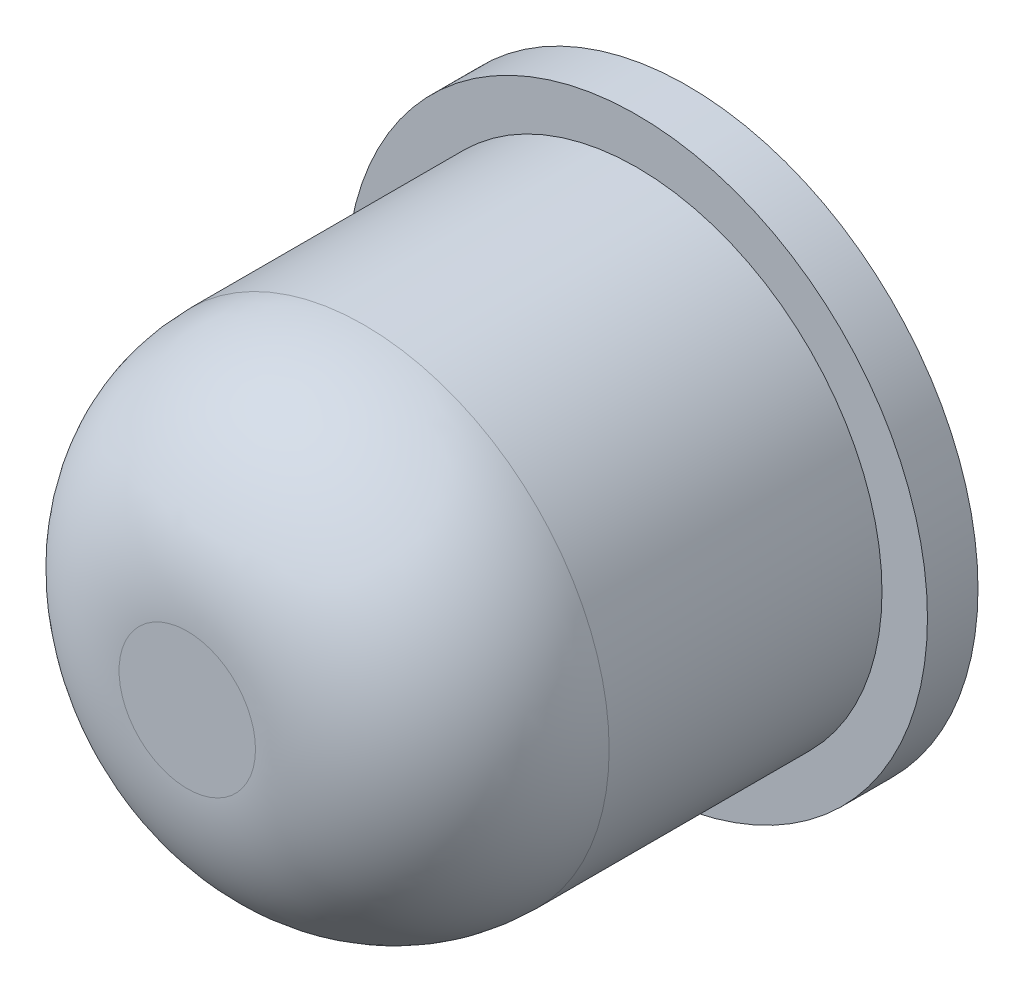
ISO-10303-21;
HEADER;
FILE_DESCRIPTION(('STEP AP214'),'2;1');
FILE_NAME('part.step','',(''),(''),'','','');
FILE_SCHEMA(('AUTOMOTIVE_DESIGN { 1 0 10303 214 1 1 1 1 }'));
ENDSEC;
DATA;
#1=APPLICATION_CONTEXT('core data for automotive mechanical design processes');
#2=APPLICATION_PROTOCOL_DEFINITION('international standard','automotive_design',2000,#1);
#3=PRODUCT_CONTEXT('',#1,'mechanical');
#4=PRODUCT('Part','Part','',(#3));
#5=PRODUCT_RELATED_PRODUCT_CATEGORY('part','',(#4));
#6=PRODUCT_DEFINITION_FORMATION('','',#4);
#7=PRODUCT_DEFINITION_CONTEXT('part definition',#1,'design');
#8=PRODUCT_DEFINITION('design','',#6,#7);
#9=PRODUCT_DEFINITION_SHAPE('','',#8);
#10=(LENGTH_UNIT() NAMED_UNIT(*) SI_UNIT(.MILLI.,.METRE.));
#11=(NAMED_UNIT(*) PLANE_ANGLE_UNIT() SI_UNIT($,.RADIAN.));
#12=(NAMED_UNIT(*) SI_UNIT($,.STERADIAN.) SOLID_ANGLE_UNIT());
#13=UNCERTAINTY_MEASURE_WITH_UNIT(LENGTH_MEASURE(1.E-05),#10,'distance_accuracy_value','');
#14=(GEOMETRIC_REPRESENTATION_CONTEXT(3) GLOBAL_UNCERTAINTY_ASSIGNED_CONTEXT((#13)) GLOBAL_UNIT_ASSIGNED_CONTEXT((#10,
#11,#12)) REPRESENTATION_CONTEXT('',''));
#15=CARTESIAN_POINT('',(0.,0.,0.));
#16=DIRECTION('',(0.,0.,1.));
#17=DIRECTION('',(1.,0.,0.));
#18=AXIS2_PLACEMENT_3D('',#15,#16,#17);
#19=CARTESIAN_POINT('',(0.,0.,10.5));
#20=DIRECTION('',(0.,0.,1.));
#21=DIRECTION('',(1.,0.,0.));
#22=AXIS2_PLACEMENT_3D('',#19,#20,#21);
#23=PLANE('',#22);
#24=CARTESIAN_POINT('',(0.,0.,10.5));
#25=DIRECTION('',(0.,0.,1.));
#26=DIRECTION('',(1.,0.,0.));
#27=AXIS2_PLACEMENT_3D('',#24,#25,#26);
#28=CIRCLE('',#27,1.35);
#29=CARTESIAN_POINT('',(1.35,0.,10.5));
#30=VERTEX_POINT('',#29);
#31=EDGE_CURVE('E9',#30,#30,#28,.T.);
#32=ORIENTED_EDGE('',*,*,#31,.T.);
#33=EDGE_LOOP('',(#32));
#34=FACE_BOUND('',#33,.T.);
#35=ADVANCED_FACE('F14',(#34),#23,.T.);
#36=CARTESIAN_POINT('',(4.85,0.,7.));
#37=CARTESIAN_POINT('',(4.85,0.,7.458148928649));
#38=CARTESIAN_POINT('',(4.778034416865,0.,7.916297092063));
#39=CARTESIAN_POINT('',(4.634101375765,0.,8.36031933005));
#40=CARTESIAN_POINT('',(4.421906269685,0.,8.776066494927));
#41=CARTESIAN_POINT('',(4.148833948394,0.,9.150913519912));
#42=CARTESIAN_POINT('',(3.500913519912,0.,9.798833948394));
#43=CARTESIAN_POINT('',(3.126066494927,0.,10.071906269685));
#44=CARTESIAN_POINT('',(2.71031933005,0.,10.284101375765));
#45=CARTESIAN_POINT('',(2.266297092063,0.,10.428034416865));
#46=CARTESIAN_POINT('',(1.808148928649,0.,10.5));
#47=CARTESIAN_POINT('',(1.35,0.,10.5));
#48=(BOUNDED_CURVE() B_SPLINE_CURVE(6,(#36,#37,#38,#39,#40,#41,#42,#43,#44,#45,#46,#47),
.UNSPECIFIED.,.F.,.F.) B_SPLINE_CURVE_WITH_KNOTS((7,5,7),(0.,0.785398163397,1.570796326795),
.UNSPECIFIED.) CURVE() GEOMETRIC_REPRESENTATION_ITEM() RATIONAL_B_SPLINE_CURVE((1.,1.,1.,1.,1.,
1.,1.,1.,1.,1.,1.,1.)) REPRESENTATION_ITEM(''));
#49=CARTESIAN_POINT('',(0.,0.,7.));
#50=DIRECTION('',(0.,0.,-1.));
#51=AXIS1_PLACEMENT('',#49,#50);
#52=SURFACE_OF_REVOLUTION('',#48,#51);
#53=ORIENTED_EDGE('',*,*,#31,.F.);
#54=EDGE_LOOP('',(#53));
#55=FACE_BOUND('',#54,.T.);
#56=CARTESIAN_POINT('',(0.,0.,7.));
#57=DIRECTION('',(0.,0.,1.));
#58=DIRECTION('',(1.,0.,0.));
#59=AXIS2_PLACEMENT_3D('',#56,#57,#58);
#60=CIRCLE('',#59,4.85);
#61=CARTESIAN_POINT('',(4.85,0.,7.));
#62=VERTEX_POINT('',#61);
#63=EDGE_CURVE('E47',#62,#62,#60,.T.);
#64=ORIENTED_EDGE('',*,*,#63,.T.);
#65=EDGE_LOOP('',(#64));
#66=FACE_BOUND('',#65,.T.);
#67=ADVANCED_FACE('F88',(#55,#66),#52,.F.);
#68=CARTESIAN_POINT('',(0.,0.,9.95));
#69=DIRECTION('',(0.,0.,1.));
#70=DIRECTION('',(1.,0.,0.));
#71=AXIS2_PLACEMENT_3D('',#68,#69,#70);
#72=PLANE('',#71);
#73=CARTESIAN_POINT('',(0.,0.,9.95));
#74=DIRECTION('',(0.,0.,1.));
#75=DIRECTION('',(1.,0.,0.));
#76=AXIS2_PLACEMENT_3D('',#73,#74,#75);
#77=CIRCLE('',#76,1.35);
#78=CARTESIAN_POINT('',(1.35,0.,9.95));
#79=VERTEX_POINT('',#78);
#80=EDGE_CURVE('E21',#79,#79,#77,.T.);
#81=ORIENTED_EDGE('',*,*,#80,.F.);
#82=EDGE_LOOP('',(#81));
#83=FACE_BOUND('',#82,.T.);
#84=ADVANCED_FACE('F85',(#83),#72,.F.);
#85=CARTESIAN_POINT('',(4.3,0.,7.));
#86=CARTESIAN_POINT('',(4.3,0.,7.386154097004));
#87=CARTESIAN_POINT('',(4.239343294215,0.,7.772307549024));
#88=CARTESIAN_POINT('',(4.118028302431,0.,8.146554863899));
#89=CARTESIAN_POINT('',(3.939178141592,0.,8.496970331438));
#90=CARTESIAN_POINT('',(3.709017185075,0.,8.812912823926));
#91=CARTESIAN_POINT('',(3.162912823926,0.,9.359017185075));
#92=CARTESIAN_POINT('',(2.846970331439,0.,9.589178141592));
#93=CARTESIAN_POINT('',(2.496554863899,0.,9.768028302431));
#94=CARTESIAN_POINT('',(2.122307549024,0.,9.889343294215));
#95=CARTESIAN_POINT('',(1.736154097004,0.,9.95));
#96=CARTESIAN_POINT('',(1.35,0.,9.95));
#97=(BOUNDED_CURVE() B_SPLINE_CURVE(6,(#85,#86,#87,#88,#89,#90,#91,#92,#93,#94,#95,#96),
.UNSPECIFIED.,.F.,.F.) B_SPLINE_CURVE_WITH_KNOTS((7,5,7),(0.,0.785398163397,1.570796326795),
.UNSPECIFIED.) CURVE() GEOMETRIC_REPRESENTATION_ITEM() RATIONAL_B_SPLINE_CURVE((1.,1.,1.,1.,1.,
1.,1.,1.,1.,1.,1.,1.)) REPRESENTATION_ITEM(''));
#98=CARTESIAN_POINT('',(0.,0.,7.));
#99=DIRECTION('',(0.,0.,-1.));
#100=AXIS1_PLACEMENT('',#98,#99);
#101=SURFACE_OF_REVOLUTION('',#97,#100);
#102=ORIENTED_EDGE('',*,*,#80,.T.);
#103=EDGE_LOOP('',(#102));
#104=FACE_BOUND('',#103,.T.);
#105=CARTESIAN_POINT('',(0.,0.,7.));
#106=DIRECTION('',(0.,0.,1.));
#107=DIRECTION('',(1.,0.,0.));
#108=AXIS2_PLACEMENT_3D('',#105,#106,#107);
#109=CIRCLE('',#108,4.3);
#110=CARTESIAN_POINT('',(4.3,0.,7.));
#111=VERTEX_POINT('',#110);
#112=EDGE_CURVE('E28',#111,#111,#109,.T.);
#113=ORIENTED_EDGE('',*,*,#112,.F.);
#114=EDGE_LOOP('',(#113));
#115=FACE_BOUND('',#114,.T.);
#116=ADVANCED_FACE('F71',(#104,#115),#101,.T.);
#117=CARTESIAN_POINT('',(0.,0.,0.6));
#118=DIRECTION('',(0.,0.,-1.));
#119=DIRECTION('',(1.,0.,0.));
#120=AXIS2_PLACEMENT_3D('',#117,#118,#119);
#121=CYLINDRICAL_SURFACE('',#120,4.3);
#122=ORIENTED_EDGE('',*,*,#112,.T.);
#123=EDGE_LOOP('',(#122));
#124=FACE_BOUND('',#123,.T.);
#125=CARTESIAN_POINT('',(0.,0.,0.6));
#126=DIRECTION('',(0.,0.,1.));
#127=DIRECTION('',(1.,0.,0.));
#128=AXIS2_PLACEMENT_3D('',#125,#126,#127);
#129=CIRCLE('',#128,4.3);
#130=CARTESIAN_POINT('',(4.30000000000003,0.,0.6));
#131=VERTEX_POINT('',#130);
#132=EDGE_CURVE('E36',#131,#131,#129,.T.);
#133=ORIENTED_EDGE('',*,*,#132,.F.);
#134=EDGE_LOOP('',(#133));
#135=FACE_BOUND('',#134,.T.);
#136=ADVANCED_FACE('F69',(#124,#135),#121,.F.);
#137=CARTESIAN_POINT('',(0.,0.,0.6));
#138=DIRECTION('',(0.,0.,1.));
#139=DIRECTION('',(1.,0.,0.));
#140=AXIS2_PLACEMENT_3D('',#137,#138,#139);
#141=PLANE('',#140);
#142=ORIENTED_EDGE('',*,*,#132,.T.);
#143=EDGE_LOOP('',(#142));
#144=FACE_BOUND('',#143,.T.);
#145=CARTESIAN_POINT('',(0.,0.,0.6));
#146=DIRECTION('',(0.,0.,1.));
#147=DIRECTION('',(1.,0.,0.));
#148=AXIS2_PLACEMENT_3D('',#145,#146,#147);
#149=CIRCLE('',#148,5.75);
#150=CARTESIAN_POINT('',(5.75,0.,0.6));
#151=VERTEX_POINT('',#150);
#152=EDGE_CURVE('E53',#151,#151,#149,.T.);
#153=ORIENTED_EDGE('',*,*,#152,.F.);
#154=EDGE_LOOP('',(#153));
#155=FACE_BOUND('',#154,.T.);
#156=ADVANCED_FACE('F70',(#144,#155),#141,.F.);
#157=CARTESIAN_POINT('',(0.,0.,0.6));
#158=DIRECTION('',(0.,0.,-1.));
#159=DIRECTION('',(1.,0.,0.));
#160=AXIS2_PLACEMENT_3D('',#157,#158,#159);
#161=CYLINDRICAL_SURFACE('',#160,5.75);
#162=CARTESIAN_POINT('',(0.,0.,1.6));
#163=DIRECTION('',(0.,0.,1.));
#164=DIRECTION('',(1.,0.,0.));
#165=AXIS2_PLACEMENT_3D('',#162,#163,#164);
#166=CIRCLE('',#165,5.75);
#167=CARTESIAN_POINT('',(5.75,0.,1.6));
#168=VERTEX_POINT('',#167);
#169=EDGE_CURVE('E49',#168,#168,#166,.T.);
#170=ORIENTED_EDGE('',*,*,#169,.F.);
#171=EDGE_LOOP('',(#170));
#172=FACE_BOUND('',#171,.T.);
#173=ORIENTED_EDGE('',*,*,#152,.T.);
#174=EDGE_LOOP('',(#173));
#175=FACE_BOUND('',#174,.T.);
#176=ADVANCED_FACE('F79',(#172,#175),#161,.T.);
#177=CARTESIAN_POINT('',(0.,0.,1.6));
#178=DIRECTION('',(0.,0.,1.));
#179=DIRECTION('',(1.,0.,0.));
#180=AXIS2_PLACEMENT_3D('',#177,#178,#179);
#181=PLANE('',#180);
#182=CARTESIAN_POINT('',(0.,0.,1.6));
#183=DIRECTION('',(0.,0.,1.));
#184=DIRECTION('',(1.,0.,0.));
#185=AXIS2_PLACEMENT_3D('',#182,#183,#184);
#186=CIRCLE('',#185,4.85);
#187=CARTESIAN_POINT('',(4.85,0.,1.6));
#188=VERTEX_POINT('',#187);
#189=EDGE_CURVE('E44',#188,#188,#186,.T.);
#190=ORIENTED_EDGE('',*,*,#189,.F.);
#191=EDGE_LOOP('',(#190));
#192=FACE_BOUND('',#191,.T.);
#193=ORIENTED_EDGE('',*,*,#169,.T.);
#194=EDGE_LOOP('',(#193));
#195=FACE_BOUND('',#194,.T.);
#196=ADVANCED_FACE('F106',(#192,#195),#181,.T.);
#197=CARTESIAN_POINT('',(0.,0.,1.6));
#198=DIRECTION('',(0.,0.,-1.));
#199=DIRECTION('',(1.,0.,0.));
#200=AXIS2_PLACEMENT_3D('',#197,#198,#199);
#201=CYLINDRICAL_SURFACE('',#200,4.85);
#202=ORIENTED_EDGE('',*,*,#63,.F.);
#203=EDGE_LOOP('',(#202));
#204=FACE_BOUND('',#203,.T.);
#205=ORIENTED_EDGE('',*,*,#189,.T.);
#206=EDGE_LOOP('',(#205));
#207=FACE_BOUND('',#206,.T.);
#208=ADVANCED_FACE('F108',(#204,#207),#201,.T.);
#209=CLOSED_SHELL('',(#35,#67,#84,#116,#136,#156,#176,#196,#208));
#210=MANIFOLD_SOLID_BREP('B1',#209);
#211=ADVANCED_BREP_SHAPE_REPRESENTATION('',(#18,#210),#14);
#212=SHAPE_DEFINITION_REPRESENTATION(#9,#211);
ENDSEC;
END-ISO-10303-21;
